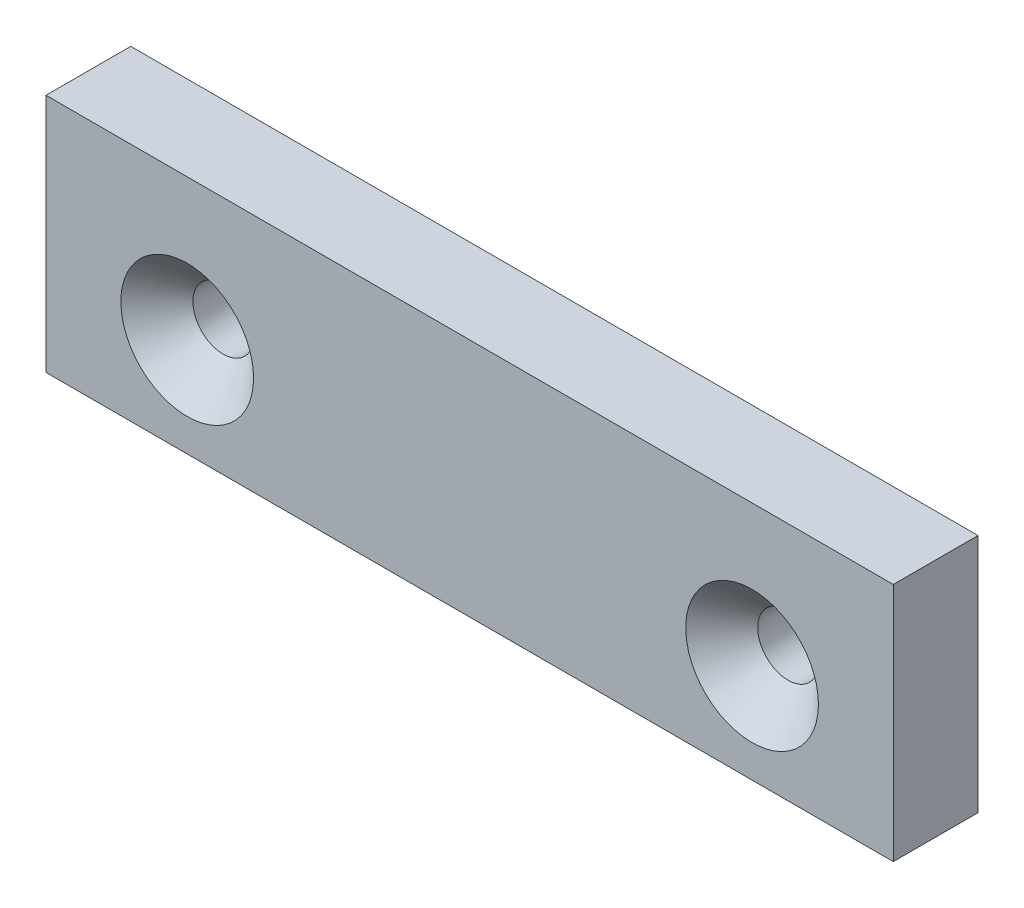
ISO-10303-21;
HEADER;
FILE_DESCRIPTION(('STEP AP214'),'2;1');
FILE_NAME('part.step','',(''),(''),'','','');
FILE_SCHEMA(('AUTOMOTIVE_DESIGN { 1 0 10303 214 1 1 1 1 }'));
ENDSEC;
DATA;
#1=APPLICATION_CONTEXT('core data for automotive mechanical design processes');
#2=APPLICATION_PROTOCOL_DEFINITION('international standard','automotive_design',2000,#1);
#3=PRODUCT_CONTEXT('',#1,'mechanical');
#4=PRODUCT('Part','Part','',(#3));
#5=PRODUCT_RELATED_PRODUCT_CATEGORY('part','',(#4));
#6=PRODUCT_DEFINITION_FORMATION('','',#4);
#7=PRODUCT_DEFINITION_CONTEXT('part definition',#1,'design');
#8=PRODUCT_DEFINITION('design','',#6,#7);
#9=PRODUCT_DEFINITION_SHAPE('','',#8);
#10=(LENGTH_UNIT() NAMED_UNIT(*) SI_UNIT(.MILLI.,.METRE.));
#11=(NAMED_UNIT(*) PLANE_ANGLE_UNIT() SI_UNIT($,.RADIAN.));
#12=(NAMED_UNIT(*) SI_UNIT($,.STERADIAN.) SOLID_ANGLE_UNIT());
#13=UNCERTAINTY_MEASURE_WITH_UNIT(LENGTH_MEASURE(1.E-05),#10,'distance_accuracy_value','');
#14=(GEOMETRIC_REPRESENTATION_CONTEXT(3) GLOBAL_UNCERTAINTY_ASSIGNED_CONTEXT((#13)) GLOBAL_UNIT_ASSIGNED_CONTEXT((#10,
#11,#12)) REPRESENTATION_CONTEXT('',''));
#15=CARTESIAN_POINT('',(0.,0.,0.));
#16=DIRECTION('',(0.,0.,1.));
#17=DIRECTION('',(1.,0.,0.));
#18=AXIS2_PLACEMENT_3D('',#15,#16,#17);
#19=CARTESIAN_POINT('',(0.,0.,6.));
#20=DIRECTION('',(0.,0.,-1.));
#21=DIRECTION('',(-1.,0.,0.));
#22=AXIS2_PLACEMENT_3D('',#19,#20,#21);
#23=PLANE('',#22);
#24=DIRECTION('',(0.,-1.,0.));
#25=VECTOR('',#24,1.);
#26=CARTESIAN_POINT('',(0.,0.,6.));
#27=LINE('',#26,#25);
#28=CARTESIAN_POINT('',(0.,17.,6.));
#29=VERTEX_POINT('',#28);
#30=CARTESIAN_POINT('',(0.,0.,6.));
#31=VERTEX_POINT('',#30);
#32=EDGE_CURVE('E92',#29,#31,#27,.T.);
#33=ORIENTED_EDGE('',*,*,#32,.T.);
#34=DIRECTION('',(1.,0.,0.));
#35=VECTOR('',#34,1.);
#36=CARTESIAN_POINT('',(0.,0.,6.));
#37=LINE('',#36,#35);
#38=CARTESIAN_POINT('',(60.,0.,6.));
#39=VERTEX_POINT('',#38);
#40=EDGE_CURVE('E87',#31,#39,#37,.T.);
#41=ORIENTED_EDGE('',*,*,#40,.T.);
#42=DIRECTION('',(0.,1.,0.));
#43=VECTOR('',#42,1.);
#44=CARTESIAN_POINT('',(60.,0.,6.));
#45=LINE('',#44,#43);
#46=CARTESIAN_POINT('',(60.,17.,6.));
#47=VERTEX_POINT('',#46);
#48=EDGE_CURVE('E90',#39,#47,#45,.T.);
#49=ORIENTED_EDGE('',*,*,#48,.T.);
#50=DIRECTION('',(-1.,0.,0.));
#51=VECTOR('',#50,1.);
#52=CARTESIAN_POINT('',(0.,17.,6.));
#53=LINE('',#52,#51);
#54=EDGE_CURVE('E57',#47,#29,#53,.T.);
#55=ORIENTED_EDGE('',*,*,#54,.T.);
#56=EDGE_LOOP('',(#33,#41,#49,#55));
#57=FACE_BOUND('',#56,.T.);
#58=CARTESIAN_POINT('',(50.,7.,6.));
#59=DIRECTION('',(0.,0.,1.));
#60=DIRECTION('',(1.,0.,0.));
#61=AXIS2_PLACEMENT_3D('',#58,#59,#60);
#62=CIRCLE('',#61,4.7);
#63=CARTESIAN_POINT('',(54.7,7.,6.));
#64=VERTEX_POINT('',#63);
#65=EDGE_CURVE('E136',#64,#64,#62,.T.);
#66=ORIENTED_EDGE('',*,*,#65,.F.);
#67=EDGE_LOOP('',(#66));
#68=FACE_BOUND('',#67,.T.);
#69=CARTESIAN_POINT('',(10.,7.,6.));
#70=DIRECTION('',(0.,0.,1.));
#71=DIRECTION('',(1.,0.,0.));
#72=AXIS2_PLACEMENT_3D('',#69,#70,#71);
#73=CIRCLE('',#72,4.7);
#74=CARTESIAN_POINT('',(14.7,7.,6.));
#75=VERTEX_POINT('',#74);
#76=EDGE_CURVE('E148',#75,#75,#73,.T.);
#77=ORIENTED_EDGE('',*,*,#76,.F.);
#78=EDGE_LOOP('',(#77));
#79=FACE_BOUND('',#78,.T.);
#80=ADVANCED_FACE('F39',(#57,#68,#79),#23,.F.);
#81=CARTESIAN_POINT('',(0.,0.,6.));
#82=DIRECTION('',(1.,0.,0.));
#83=DIRECTION('',(0.,0.,-1.));
#84=AXIS2_PLACEMENT_3D('',#81,#82,#83);
#85=PLANE('',#84);
#86=DIRECTION('',(0.,-1.,0.));
#87=VECTOR('',#86,1.);
#88=CARTESIAN_POINT('',(0.,0.,0.));
#89=LINE('',#88,#87);
#90=CARTESIAN_POINT('',(0.,17.,0.));
#91=VERTEX_POINT('',#90);
#92=CARTESIAN_POINT('',(0.,0.,0.));
#93=VERTEX_POINT('',#92);
#94=EDGE_CURVE('E108',#91,#93,#89,.T.);
#95=ORIENTED_EDGE('',*,*,#94,.T.);
#96=DIRECTION('',(0.,0.,-1.));
#97=VECTOR('',#96,1.);
#98=CARTESIAN_POINT('',(0.,0.,6.));
#99=LINE('',#98,#97);
#100=EDGE_CURVE('E11',#31,#93,#99,.T.);
#101=ORIENTED_EDGE('',*,*,#100,.F.);
#102=ORIENTED_EDGE('',*,*,#32,.F.);
#103=DIRECTION('',(0.,0.,-1.));
#104=VECTOR('',#103,1.);
#105=CARTESIAN_POINT('',(0.,17.,6.));
#106=LINE('',#105,#104);
#107=EDGE_CURVE('E104',#29,#91,#106,.T.);
#108=ORIENTED_EDGE('',*,*,#107,.T.);
#109=EDGE_LOOP('',(#95,#101,#102,#108));
#110=FACE_BOUND('',#109,.T.);
#111=ADVANCED_FACE('F41',(#110),#85,.F.);
#112=CARTESIAN_POINT('',(0.,0.,6.));
#113=DIRECTION('',(0.,1.,0.));
#114=DIRECTION('',(0.,0.,1.));
#115=AXIS2_PLACEMENT_3D('',#112,#113,#114);
#116=PLANE('',#115);
#117=DIRECTION('',(1.,0.,0.));
#118=VECTOR('',#117,1.);
#119=CARTESIAN_POINT('',(0.,0.,0.));
#120=LINE('',#119,#118);
#121=CARTESIAN_POINT('',(60.,0.,0.));
#122=VERTEX_POINT('',#121);
#123=EDGE_CURVE('E97',#93,#122,#120,.T.);
#124=ORIENTED_EDGE('',*,*,#123,.T.);
#125=DIRECTION('',(0.,0.,-1.));
#126=VECTOR('',#125,1.);
#127=CARTESIAN_POINT('',(60.,0.,6.));
#128=LINE('',#127,#126);
#129=EDGE_CURVE('E49',#39,#122,#128,.T.);
#130=ORIENTED_EDGE('',*,*,#129,.F.);
#131=ORIENTED_EDGE('',*,*,#40,.F.);
#132=ORIENTED_EDGE('',*,*,#100,.T.);
#133=EDGE_LOOP('',(#124,#130,#131,#132));
#134=FACE_BOUND('',#133,.T.);
#135=ADVANCED_FACE('F96',(#134),#116,.F.);
#136=CARTESIAN_POINT('',(60.,0.,6.));
#137=DIRECTION('',(-1.,0.,0.));
#138=DIRECTION('',(0.,0.,1.));
#139=AXIS2_PLACEMENT_3D('',#136,#137,#138);
#140=PLANE('',#139);
#141=DIRECTION('',(0.,1.,0.));
#142=VECTOR('',#141,1.);
#143=CARTESIAN_POINT('',(60.,0.,0.));
#144=LINE('',#143,#142);
#145=CARTESIAN_POINT('',(60.,17.,0.));
#146=VERTEX_POINT('',#145);
#147=EDGE_CURVE('E74',#122,#146,#144,.T.);
#148=ORIENTED_EDGE('',*,*,#147,.T.);
#149=DIRECTION('',(0.,0.,-1.));
#150=VECTOR('',#149,1.);
#151=CARTESIAN_POINT('',(60.,17.,6.));
#152=LINE('',#151,#150);
#153=EDGE_CURVE('E99',#47,#146,#152,.T.);
#154=ORIENTED_EDGE('',*,*,#153,.F.);
#155=ORIENTED_EDGE('',*,*,#48,.F.);
#156=ORIENTED_EDGE('',*,*,#129,.T.);
#157=EDGE_LOOP('',(#148,#154,#155,#156));
#158=FACE_BOUND('',#157,.T.);
#159=ADVANCED_FACE('F100',(#158),#140,.F.);
#160=CARTESIAN_POINT('',(0.,17.,6.));
#161=DIRECTION('',(0.,-1.,0.));
#162=DIRECTION('',(0.,0.,-1.));
#163=AXIS2_PLACEMENT_3D('',#160,#161,#162);
#164=PLANE('',#163);
#165=DIRECTION('',(-1.,0.,0.));
#166=VECTOR('',#165,1.);
#167=CARTESIAN_POINT('',(0.,17.,0.));
#168=LINE('',#167,#166);
#169=EDGE_CURVE('E80',#146,#91,#168,.T.);
#170=ORIENTED_EDGE('',*,*,#169,.T.);
#171=ORIENTED_EDGE('',*,*,#107,.F.);
#172=ORIENTED_EDGE('',*,*,#54,.F.);
#173=ORIENTED_EDGE('',*,*,#153,.T.);
#174=EDGE_LOOP('',(#170,#171,#172,#173));
#175=FACE_BOUND('',#174,.T.);
#176=ADVANCED_FACE('F122',(#175),#164,.F.);
#177=CARTESIAN_POINT('',(0.,0.,0.));
#178=DIRECTION('',(0.,0.,-1.));
#179=DIRECTION('',(-1.,0.,0.));
#180=AXIS2_PLACEMENT_3D('',#177,#178,#179);
#181=PLANE('',#180);
#182=CARTESIAN_POINT('',(10.,7.,0.));
#183=DIRECTION('',(0.,0.,-1.));
#184=DIRECTION('',(-1.,0.,0.));
#185=AXIS2_PLACEMENT_3D('',#182,#183,#184);
#186=CIRCLE('',#185,2.15);
#187=CARTESIAN_POINT('',(7.85,7.,0.));
#188=VERTEX_POINT('',#187);
#189=EDGE_CURVE('E140',#188,#188,#186,.T.);
#190=ORIENTED_EDGE('',*,*,#189,.F.);
#191=EDGE_LOOP('',(#190));
#192=FACE_BOUND('',#191,.T.);
#193=CARTESIAN_POINT('',(50.,7.,0.));
#194=DIRECTION('',(0.,0.,-1.));
#195=DIRECTION('',(-1.,0.,0.));
#196=AXIS2_PLACEMENT_3D('',#193,#194,#195);
#197=CIRCLE('',#196,2.15);
#198=CARTESIAN_POINT('',(47.85,7.,0.));
#199=VERTEX_POINT('',#198);
#200=EDGE_CURVE('E112',#199,#199,#197,.T.);
#201=ORIENTED_EDGE('',*,*,#200,.F.);
#202=EDGE_LOOP('',(#201));
#203=FACE_BOUND('',#202,.T.);
#204=ORIENTED_EDGE('',*,*,#94,.F.);
#205=ORIENTED_EDGE('',*,*,#169,.F.);
#206=ORIENTED_EDGE('',*,*,#147,.F.);
#207=ORIENTED_EDGE('',*,*,#123,.F.);
#208=EDGE_LOOP('',(#204,#205,#206,#207));
#209=FACE_BOUND('',#208,.T.);
#210=ADVANCED_FACE('F125',(#192,#203,#209),#181,.T.);
#211=CARTESIAN_POINT('',(50.,7.,6.));
#212=DIRECTION('',(0.,0.,1.));
#213=DIRECTION('',(1.,0.,0.));
#214=AXIS2_PLACEMENT_3D('',#211,#212,#213);
#215=CYLINDRICAL_SURFACE('',#214,2.15);
#216=CARTESIAN_POINT('',(50.,7.,3.45));
#217=DIRECTION('',(0.,0.,1.));
#218=DIRECTION('',(1.,0.,0.));
#219=AXIS2_PLACEMENT_3D('',#216,#217,#218);
#220=CIRCLE('',#219,2.15);
#221=CARTESIAN_POINT('',(52.15,7.,3.45));
#222=VERTEX_POINT('',#221);
#223=EDGE_CURVE('E132',#222,#222,#220,.T.);
#224=ORIENTED_EDGE('',*,*,#223,.T.);
#225=EDGE_LOOP('',(#224));
#226=FACE_BOUND('',#225,.T.);
#227=ORIENTED_EDGE('',*,*,#200,.T.);
#228=EDGE_LOOP('',(#227));
#229=FACE_BOUND('',#228,.T.);
#230=ADVANCED_FACE('F162',(#226,#229),#215,.F.);
#231=CARTESIAN_POINT('',(50.,7.,6.));
#232=DIRECTION('',(0.,0.,1.));
#233=DIRECTION('',(1.,0.,0.));
#234=AXIS2_PLACEMENT_3D('',#231,#232,#233);
#235=CONICAL_SURFACE('',#234,4.7,0.78539816339745);
#236=ORIENTED_EDGE('',*,*,#223,.F.);
#237=EDGE_LOOP('',(#236));
#238=FACE_BOUND('',#237,.T.);
#239=ORIENTED_EDGE('',*,*,#65,.T.);
#240=EDGE_LOOP('',(#239));
#241=FACE_BOUND('',#240,.T.);
#242=ADVANCED_FACE('F193',(#238,#241),#235,.F.);
#243=CARTESIAN_POINT('',(10.,7.,6.));
#244=DIRECTION('',(0.,0.,1.));
#245=DIRECTION('',(1.,0.,0.));
#246=AXIS2_PLACEMENT_3D('',#243,#244,#245);
#247=CYLINDRICAL_SURFACE('',#246,2.15);
#248=CARTESIAN_POINT('',(10.,7.,3.45));
#249=DIRECTION('',(0.,0.,1.));
#250=DIRECTION('',(1.,0.,0.));
#251=AXIS2_PLACEMENT_3D('',#248,#249,#250);
#252=CIRCLE('',#251,2.15);
#253=CARTESIAN_POINT('',(12.15,7.,3.45));
#254=VERTEX_POINT('',#253);
#255=EDGE_CURVE('E144',#254,#254,#252,.T.);
#256=ORIENTED_EDGE('',*,*,#255,.T.);
#257=EDGE_LOOP('',(#256));
#258=FACE_BOUND('',#257,.T.);
#259=ORIENTED_EDGE('',*,*,#189,.T.);
#260=EDGE_LOOP('',(#259));
#261=FACE_BOUND('',#260,.T.);
#262=ADVANCED_FACE('F200',(#258,#261),#247,.F.);
#263=CARTESIAN_POINT('',(10.,7.,6.));
#264=DIRECTION('',(0.,0.,1.));
#265=DIRECTION('',(1.,0.,0.));
#266=AXIS2_PLACEMENT_3D('',#263,#264,#265);
#267=CONICAL_SURFACE('',#266,4.7,0.785398163397449);
#268=ORIENTED_EDGE('',*,*,#255,.F.);
#269=EDGE_LOOP('',(#268));
#270=FACE_BOUND('',#269,.T.);
#271=ORIENTED_EDGE('',*,*,#76,.T.);
#272=EDGE_LOOP('',(#271));
#273=FACE_BOUND('',#272,.T.);
#274=ADVANCED_FACE('F153',(#270,#273),#267,.F.);
#275=CLOSED_SHELL('',(#80,#111,#135,#159,#176,#210,#230,#242,#262,#274));
#276=MANIFOLD_SOLID_BREP('B2',#275);
#277=ADVANCED_BREP_SHAPE_REPRESENTATION('',(#18,#276),#14);
#278=SHAPE_DEFINITION_REPRESENTATION(#9,#277);
ENDSEC;
END-ISO-10303-21;
